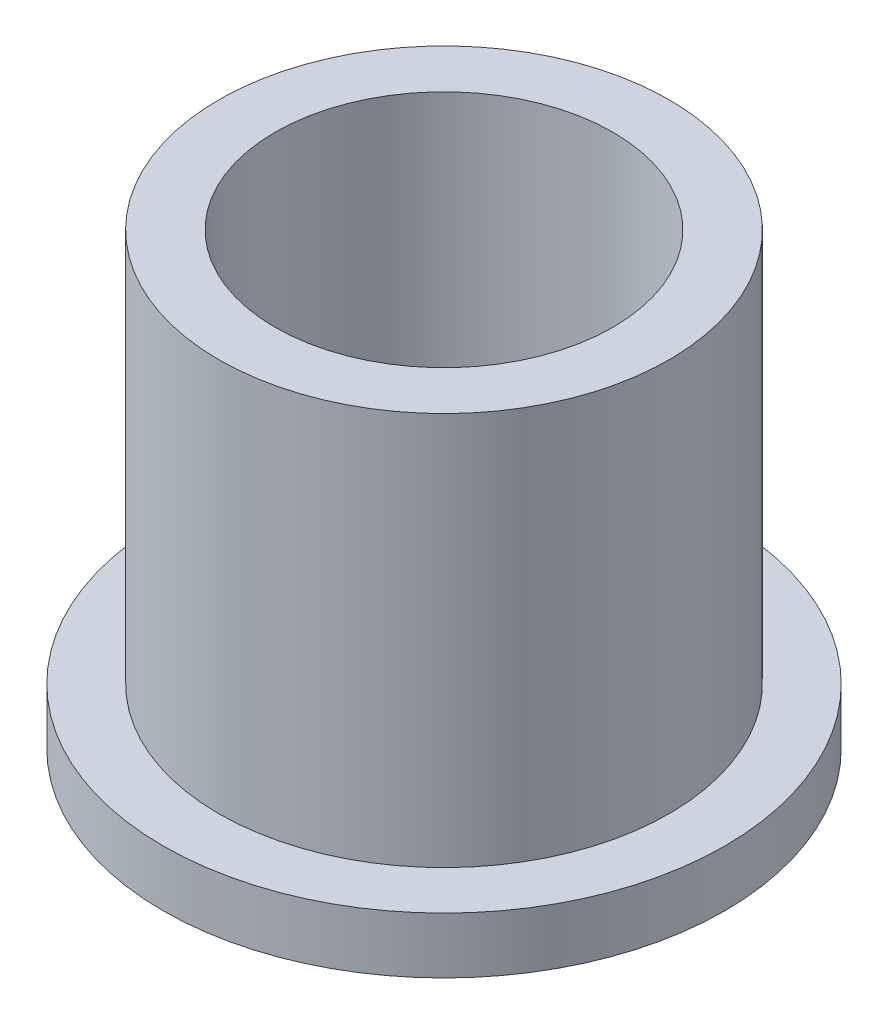
ISO-10303-21;
HEADER;
FILE_DESCRIPTION(('STEP AP214'),'2;1');
FILE_NAME('part.step','',(''),(''),'','','');
FILE_SCHEMA(('AUTOMOTIVE_DESIGN { 1 0 10303 214 1 1 1 1 }'));
ENDSEC;
DATA;
#1=APPLICATION_CONTEXT('core data for automotive mechanical design processes');
#2=APPLICATION_PROTOCOL_DEFINITION('international standard','automotive_design',2000,#1);
#3=PRODUCT_CONTEXT('',#1,'mechanical');
#4=PRODUCT('Part','Part','',(#3));
#5=PRODUCT_RELATED_PRODUCT_CATEGORY('part','',(#4));
#6=PRODUCT_DEFINITION_FORMATION('','',#4);
#7=PRODUCT_DEFINITION_CONTEXT('part definition',#1,'design');
#8=PRODUCT_DEFINITION('design','',#6,#7);
#9=PRODUCT_DEFINITION_SHAPE('','',#8);
#10=(LENGTH_UNIT() NAMED_UNIT(*) SI_UNIT(.MILLI.,.METRE.));
#11=(NAMED_UNIT(*) PLANE_ANGLE_UNIT() SI_UNIT($,.RADIAN.));
#12=(NAMED_UNIT(*) SI_UNIT($,.STERADIAN.) SOLID_ANGLE_UNIT());
#13=UNCERTAINTY_MEASURE_WITH_UNIT(LENGTH_MEASURE(1.E-05),#10,'distance_accuracy_value','');
#14=(GEOMETRIC_REPRESENTATION_CONTEXT(3) GLOBAL_UNCERTAINTY_ASSIGNED_CONTEXT((#13)) GLOBAL_UNIT_ASSIGNED_CONTEXT((#10,
#11,#12)) REPRESENTATION_CONTEXT('',''));
#15=CARTESIAN_POINT('',(0.,0.,0.));
#16=DIRECTION('',(0.,0.,1.));
#17=DIRECTION('',(1.,0.,0.));
#18=AXIS2_PLACEMENT_3D('',#15,#16,#17);
#19=CARTESIAN_POINT('',(0.,12.7,0.));
#20=DIRECTION('',(0.,1.,0.));
#21=DIRECTION('',(0.,0.,1.));
#22=AXIS2_PLACEMENT_3D('',#19,#20,#21);
#23=PLANE('',#22);
#24=CARTESIAN_POINT('',(0.,12.7,0.));
#25=DIRECTION('',(0.,1.,0.));
#26=DIRECTION('',(0.,0.,1.));
#27=AXIS2_PLACEMENT_3D('',#24,#25,#26);
#28=CIRCLE('',#27,6.3627);
#29=CARTESIAN_POINT('',(0.,12.7,6.3627));
#30=VERTEX_POINT('',#29);
#31=EDGE_CURVE('E10',#30,#30,#28,.T.);
#32=ORIENTED_EDGE('',*,*,#31,.T.);
#33=EDGE_LOOP('',(#32));
#34=FACE_BOUND('',#33,.T.);
#35=CARTESIAN_POINT('',(0.,12.7,0.));
#36=DIRECTION('',(0.,1.,0.));
#37=DIRECTION('',(0.,0.,1.));
#38=AXIS2_PLACEMENT_3D('',#35,#36,#37);
#39=CIRCLE('',#38,4.7752);
#40=CARTESIAN_POINT('',(0.,12.7,4.7752));
#41=VERTEX_POINT('',#40);
#42=EDGE_CURVE('E37',#41,#41,#39,.T.);
#43=ORIENTED_EDGE('',*,*,#42,.F.);
#44=EDGE_LOOP('',(#43));
#45=FACE_BOUND('',#44,.T.);
#46=ADVANCED_FACE('F30',(#34,#45),#23,.T.);
#47=CARTESIAN_POINT('',(0.,0.,0.));
#48=DIRECTION('',(0.,1.,0.));
#49=DIRECTION('',(0.,0.,1.));
#50=AXIS2_PLACEMENT_3D('',#47,#48,#49);
#51=PLANE('',#50);
#52=CARTESIAN_POINT('',(0.,0.,0.));
#53=DIRECTION('',(0.,1.,0.));
#54=DIRECTION('',(0.,0.,1.));
#55=AXIS2_PLACEMENT_3D('',#52,#53,#54);
#56=CIRCLE('',#55,4.7752);
#57=CARTESIAN_POINT('',(0.,0.,4.7752));
#58=VERTEX_POINT('',#57);
#59=EDGE_CURVE('E41',#58,#58,#56,.T.);
#60=ORIENTED_EDGE('',*,*,#59,.T.);
#61=EDGE_LOOP('',(#60));
#62=FACE_BOUND('',#61,.T.);
#63=CARTESIAN_POINT('',(0.,0.,0.));
#64=DIRECTION('',(0.,1.,0.));
#65=DIRECTION('',(0.,0.,1.));
#66=AXIS2_PLACEMENT_3D('',#63,#64,#65);
#67=CIRCLE('',#66,7.9375);
#68=CARTESIAN_POINT('',(0.,0.,7.9375));
#69=VERTEX_POINT('',#68);
#70=EDGE_CURVE('E48',#69,#69,#67,.T.);
#71=ORIENTED_EDGE('',*,*,#70,.F.);
#72=EDGE_LOOP('',(#71));
#73=FACE_BOUND('',#72,.T.);
#74=ADVANCED_FACE('F73',(#62,#73),#51,.F.);
#75=CARTESIAN_POINT('',(0.,12.7,0.));
#76=DIRECTION('',(0.,-1.,0.));
#77=DIRECTION('',(0.,0.,-1.));
#78=AXIS2_PLACEMENT_3D('',#75,#76,#77);
#79=CYLINDRICAL_SURFACE('',#78,6.3627);
#80=CARTESIAN_POINT('',(0.,1.5875,0.));
#81=DIRECTION('',(0.,1.,0.));
#82=DIRECTION('',(0.,0.,1.));
#83=AXIS2_PLACEMENT_3D('',#80,#81,#82);
#84=CIRCLE('',#83,6.3627);
#85=CARTESIAN_POINT('',(0.,1.5875,6.3627));
#86=VERTEX_POINT('',#85);
#87=EDGE_CURVE('E51',#86,#86,#84,.T.);
#88=ORIENTED_EDGE('',*,*,#87,.T.);
#89=EDGE_LOOP('',(#88));
#90=FACE_BOUND('',#89,.T.);
#91=ORIENTED_EDGE('',*,*,#31,.F.);
#92=EDGE_LOOP('',(#91));
#93=FACE_BOUND('',#92,.T.);
#94=ADVANCED_FACE('F32',(#90,#93),#79,.T.);
#95=CARTESIAN_POINT('',(0.,12.7,0.));
#96=DIRECTION('',(0.,-1.,0.));
#97=DIRECTION('',(0.,0.,-1.));
#98=AXIS2_PLACEMENT_3D('',#95,#96,#97);
#99=CYLINDRICAL_SURFACE('',#98,4.7752);
#100=ORIENTED_EDGE('',*,*,#42,.T.);
#101=EDGE_LOOP('',(#100));
#102=FACE_BOUND('',#101,.T.);
#103=ORIENTED_EDGE('',*,*,#59,.F.);
#104=EDGE_LOOP('',(#103));
#105=FACE_BOUND('',#104,.T.);
#106=ADVANCED_FACE('F62',(#102,#105),#99,.F.);
#107=CARTESIAN_POINT('',(0.,1.5875,0.));
#108=DIRECTION('',(0.,1.,0.));
#109=DIRECTION('',(0.,0.,1.));
#110=AXIS2_PLACEMENT_3D('',#107,#108,#109);
#111=PLANE('',#110);
#112=CARTESIAN_POINT('',(0.,1.5875,0.));
#113=DIRECTION('',(0.,1.,0.));
#114=DIRECTION('',(0.,0.,1.));
#115=AXIS2_PLACEMENT_3D('',#112,#113,#114);
#116=CIRCLE('',#115,7.9375);
#117=CARTESIAN_POINT('',(0.,1.5875,7.9375));
#118=VERTEX_POINT('',#117);
#119=EDGE_CURVE('E46',#118,#118,#116,.T.);
#120=ORIENTED_EDGE('',*,*,#119,.T.);
#121=EDGE_LOOP('',(#120));
#122=FACE_BOUND('',#121,.T.);
#123=ORIENTED_EDGE('',*,*,#87,.F.);
#124=EDGE_LOOP('',(#123));
#125=FACE_BOUND('',#124,.T.);
#126=ADVANCED_FACE('F59',(#122,#125),#111,.T.);
#127=CARTESIAN_POINT('',(0.,1.5875,0.));
#128=DIRECTION('',(0.,-1.,0.));
#129=DIRECTION('',(0.,0.,-1.));
#130=AXIS2_PLACEMENT_3D('',#127,#128,#129);
#131=CYLINDRICAL_SURFACE('',#130,7.9375);
#132=ORIENTED_EDGE('',*,*,#119,.F.);
#133=EDGE_LOOP('',(#132));
#134=FACE_BOUND('',#133,.T.);
#135=ORIENTED_EDGE('',*,*,#70,.T.);
#136=EDGE_LOOP('',(#135));
#137=FACE_BOUND('',#136,.T.);
#138=ADVANCED_FACE('F61',(#134,#137),#131,.T.);
#139=CLOSED_SHELL('',(#46,#74,#94,#106,#126,#138));
#140=MANIFOLD_SOLID_BREP('B2',#139);
#141=ADVANCED_BREP_SHAPE_REPRESENTATION('',(#18,#140),#14);
#142=SHAPE_DEFINITION_REPRESENTATION(#9,#141);
ENDSEC;
END-ISO-10303-21;
